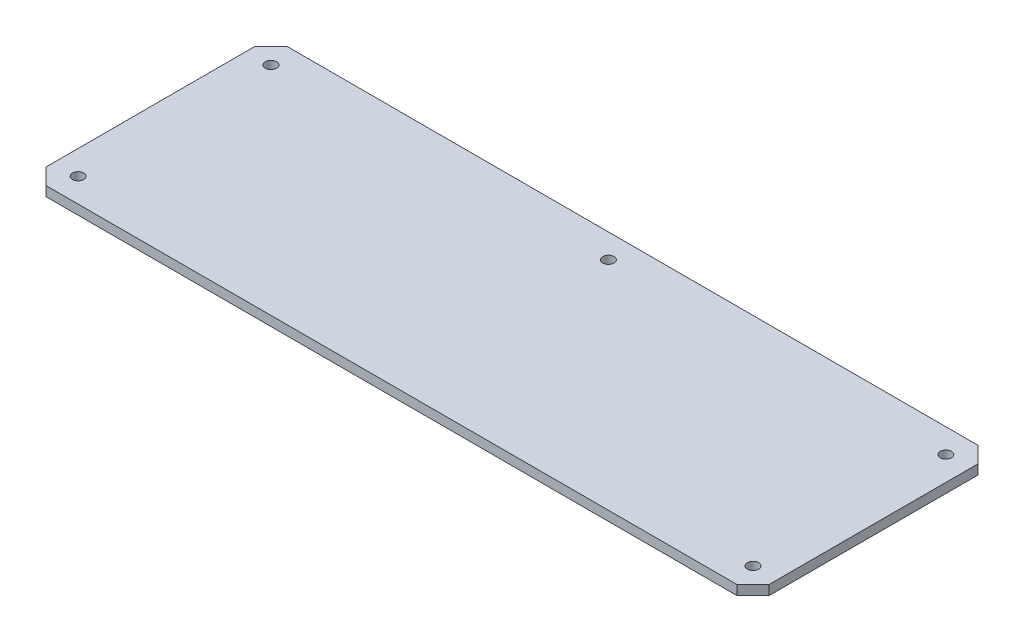
ISO-10303-21;
HEADER;
FILE_DESCRIPTION(('STEP AP214'),'2;1');
FILE_NAME('part.step','',(''),(''),'','','');
FILE_SCHEMA(('AUTOMOTIVE_DESIGN { 1 0 10303 214 1 1 1 1 }'));
ENDSEC;
DATA;
#1=APPLICATION_CONTEXT('core data for automotive mechanical design processes');
#2=APPLICATION_PROTOCOL_DEFINITION('international standard','automotive_design',2000,#1);
#3=PRODUCT_CONTEXT('',#1,'mechanical');
#4=PRODUCT('Part','Part','',(#3));
#5=PRODUCT_RELATED_PRODUCT_CATEGORY('part','',(#4));
#6=PRODUCT_DEFINITION_FORMATION('','',#4);
#7=PRODUCT_DEFINITION_CONTEXT('part definition',#1,'design');
#8=PRODUCT_DEFINITION('design','',#6,#7);
#9=PRODUCT_DEFINITION_SHAPE('','',#8);
#10=(LENGTH_UNIT() NAMED_UNIT(*) SI_UNIT(.MILLI.,.METRE.));
#11=(NAMED_UNIT(*) PLANE_ANGLE_UNIT() SI_UNIT($,.RADIAN.));
#12=(NAMED_UNIT(*) SI_UNIT($,.STERADIAN.) SOLID_ANGLE_UNIT());
#13=UNCERTAINTY_MEASURE_WITH_UNIT(LENGTH_MEASURE(1.E-05),#10,'distance_accuracy_value','');
#14=(GEOMETRIC_REPRESENTATION_CONTEXT(3) GLOBAL_UNCERTAINTY_ASSIGNED_CONTEXT((#13)) GLOBAL_UNIT_ASSIGNED_CONTEXT((#10,
#11,#12)) REPRESENTATION_CONTEXT('',''));
#15=CARTESIAN_POINT('',(0.,0.,0.));
#16=DIRECTION('',(0.,0.,1.));
#17=DIRECTION('',(1.,0.,0.));
#18=AXIS2_PLACEMENT_3D('',#15,#16,#17);
#19=CARTESIAN_POINT('',(225.,285.,-710.5));
#20=DIRECTION('',(1.,0.,0.));
#21=DIRECTION('',(0.,0.,-1.));
#22=AXIS2_PLACEMENT_3D('',#19,#20,#21);
#23=PLANE('',#22);
#24=DIRECTION('',(0.,0.,-1.));
#25=VECTOR('',#24,1.);
#26=CARTESIAN_POINT('',(225.,291.,-710.5));
#27=LINE('',#26,#25);
#28=CARTESIAN_POINT('',(225.,291.,-570.5));
#29=VERTEX_POINT('',#28);
#30=CARTESIAN_POINT('',(225.,291.,-700.5));
#31=VERTEX_POINT('',#30);
#32=EDGE_CURVE('E127',#29,#31,#27,.T.);
#33=ORIENTED_EDGE('',*,*,#32,.F.);
#34=DIRECTION('',(0.,-1.,0.));
#35=VECTOR('',#34,1.);
#36=CARTESIAN_POINT('',(225.,285.,-570.5));
#37=LINE('',#36,#35);
#38=CARTESIAN_POINT('',(225.,285.,-570.5));
#39=VERTEX_POINT('',#38);
#40=EDGE_CURVE('E75',#29,#39,#37,.T.);
#41=ORIENTED_EDGE('',*,*,#40,.T.);
#42=DIRECTION('',(0.,0.,-1.));
#43=VECTOR('',#42,1.);
#44=CARTESIAN_POINT('',(225.,285.,-710.5));
#45=LINE('',#44,#43);
#46=CARTESIAN_POINT('',(225.,285.,-700.5));
#47=VERTEX_POINT('',#46);
#48=EDGE_CURVE('E145',#39,#47,#45,.T.);
#49=ORIENTED_EDGE('',*,*,#48,.T.);
#50=DIRECTION('',(0.,1.,0.));
#51=VECTOR('',#50,1.);
#52=CARTESIAN_POINT('',(225.,285.,-700.5));
#53=LINE('',#52,#51);
#54=EDGE_CURVE('E142',#47,#31,#53,.T.);
#55=ORIENTED_EDGE('',*,*,#54,.T.);
#56=EDGE_LOOP('',(#33,#41,#49,#55));
#57=FACE_BOUND('',#56,.T.);
#58=ADVANCED_FACE('F67',(#57),#23,.T.);
#59=CARTESIAN_POINT('',(-225.,285.,-560.5));
#60=DIRECTION('',(0.,0.,1.));
#61=DIRECTION('',(1.,0.,0.));
#62=AXIS2_PLACEMENT_3D('',#59,#60,#61);
#63=PLANE('',#62);
#64=DIRECTION('',(1.,0.,0.));
#65=VECTOR('',#64,1.);
#66=CARTESIAN_POINT('',(-225.,285.,-560.5));
#67=LINE('',#66,#65);
#68=CARTESIAN_POINT('',(-215.,285.,-560.5));
#69=VERTEX_POINT('',#68);
#70=CARTESIAN_POINT('',(215.,285.,-560.5));
#71=VERTEX_POINT('',#70);
#72=EDGE_CURVE('E147',#69,#71,#67,.T.);
#73=ORIENTED_EDGE('',*,*,#72,.T.);
#74=DIRECTION('',(0.,1.,0.));
#75=VECTOR('',#74,1.);
#76=CARTESIAN_POINT('',(215.,285.,-560.5));
#77=LINE('',#76,#75);
#78=CARTESIAN_POINT('',(215.,291.,-560.5));
#79=VERTEX_POINT('',#78);
#80=EDGE_CURVE('E177',#71,#79,#77,.T.);
#81=ORIENTED_EDGE('',*,*,#80,.T.);
#82=DIRECTION('',(1.,0.,0.));
#83=VECTOR('',#82,1.);
#84=CARTESIAN_POINT('',(-225.,291.,-560.5));
#85=LINE('',#84,#83);
#86=CARTESIAN_POINT('',(-215.,291.,-560.5));
#87=VERTEX_POINT('',#86);
#88=EDGE_CURVE('E153',#87,#79,#85,.T.);
#89=ORIENTED_EDGE('',*,*,#88,.F.);
#90=DIRECTION('',(0.,-1.,0.));
#91=VECTOR('',#90,1.);
#92=CARTESIAN_POINT('',(-215.,285.,-560.5));
#93=LINE('',#92,#91);
#94=EDGE_CURVE('E173',#87,#69,#93,.T.);
#95=ORIENTED_EDGE('',*,*,#94,.T.);
#96=EDGE_LOOP('',(#73,#81,#89,#95));
#97=FACE_BOUND('',#96,.T.);
#98=ADVANCED_FACE('F183',(#97),#63,.T.);
#99=CARTESIAN_POINT('',(-225.,285.,-710.5));
#100=DIRECTION('',(-1.,0.,0.));
#101=DIRECTION('',(0.,0.,1.));
#102=AXIS2_PLACEMENT_3D('',#99,#100,#101);
#103=PLANE('',#102);
#104=DIRECTION('',(0.,0.,1.));
#105=VECTOR('',#104,1.);
#106=CARTESIAN_POINT('',(-225.,285.,-710.5));
#107=LINE('',#106,#105);
#108=CARTESIAN_POINT('',(-225.,285.,-700.5));
#109=VERTEX_POINT('',#108);
#110=CARTESIAN_POINT('',(-225.,285.,-570.5));
#111=VERTEX_POINT('',#110);
#112=EDGE_CURVE('E150',#109,#111,#107,.T.);
#113=ORIENTED_EDGE('',*,*,#112,.T.);
#114=DIRECTION('',(0.,1.,0.));
#115=VECTOR('',#114,1.);
#116=CARTESIAN_POINT('',(-225.,285.,-570.5));
#117=LINE('',#116,#115);
#118=CARTESIAN_POINT('',(-225.,291.,-570.5));
#119=VERTEX_POINT('',#118);
#120=EDGE_CURVE('E168',#111,#119,#117,.T.);
#121=ORIENTED_EDGE('',*,*,#120,.T.);
#122=DIRECTION('',(0.,0.,1.));
#123=VECTOR('',#122,1.);
#124=CARTESIAN_POINT('',(-225.,291.,-710.5));
#125=LINE('',#124,#123);
#126=CARTESIAN_POINT('',(-225.,291.,-700.5));
#127=VERTEX_POINT('',#126);
#128=EDGE_CURVE('E189',#127,#119,#125,.T.);
#129=ORIENTED_EDGE('',*,*,#128,.F.);
#130=DIRECTION('',(0.,-1.,0.));
#131=VECTOR('',#130,1.);
#132=CARTESIAN_POINT('',(-225.,285.,-700.5));
#133=LINE('',#132,#131);
#134=EDGE_CURVE('E164',#127,#109,#133,.T.);
#135=ORIENTED_EDGE('',*,*,#134,.T.);
#136=EDGE_LOOP('',(#113,#121,#129,#135));
#137=FACE_BOUND('',#136,.T.);
#138=ADVANCED_FACE('F258',(#137),#103,.T.);
#139=CARTESIAN_POINT('',(-225.,285.,-710.5));
#140=DIRECTION('',(0.,0.,-1.));
#141=DIRECTION('',(-1.,0.,0.));
#142=AXIS2_PLACEMENT_3D('',#139,#140,#141);
#143=PLANE('',#142);
#144=DIRECTION('',(-1.,0.,0.));
#145=VECTOR('',#144,1.);
#146=CARTESIAN_POINT('',(-225.,285.,-710.5));
#147=LINE('',#146,#145);
#148=CARTESIAN_POINT('',(215.,285.,-710.5));
#149=VERTEX_POINT('',#148);
#150=CARTESIAN_POINT('',(-215.,285.,-710.5));
#151=VERTEX_POINT('',#150);
#152=EDGE_CURVE('E190',#149,#151,#147,.T.);
#153=ORIENTED_EDGE('',*,*,#152,.T.);
#154=DIRECTION('',(0.,1.,0.));
#155=VECTOR('',#154,1.);
#156=CARTESIAN_POINT('',(-215.,285.,-710.5));
#157=LINE('',#156,#155);
#158=CARTESIAN_POINT('',(-215.,291.,-710.5));
#159=VERTEX_POINT('',#158);
#160=EDGE_CURVE('E159',#151,#159,#157,.T.);
#161=ORIENTED_EDGE('',*,*,#160,.T.);
#162=DIRECTION('',(-1.,0.,0.));
#163=VECTOR('',#162,1.);
#164=CARTESIAN_POINT('',(-225.,291.,-710.5));
#165=LINE('',#164,#163);
#166=CARTESIAN_POINT('',(215.,291.,-710.5));
#167=VERTEX_POINT('',#166);
#168=EDGE_CURVE('E134',#167,#159,#165,.T.);
#169=ORIENTED_EDGE('',*,*,#168,.F.);
#170=DIRECTION('',(0.,-1.,0.));
#171=VECTOR('',#170,1.);
#172=CARTESIAN_POINT('',(215.,285.,-710.5));
#173=LINE('',#172,#171);
#174=EDGE_CURVE('E143',#167,#149,#173,.T.);
#175=ORIENTED_EDGE('',*,*,#174,.T.);
#176=EDGE_LOOP('',(#153,#161,#169,#175));
#177=FACE_BOUND('',#176,.T.);
#178=ADVANCED_FACE('F235',(#177),#143,.T.);
#179=CARTESIAN_POINT('',(0.,285.,0.));
#180=DIRECTION('',(0.,1.,0.));
#181=DIRECTION('',(0.,0.,1.));
#182=AXIS2_PLACEMENT_3D('',#179,#180,#181);
#183=PLANE('',#182);
#184=CARTESIAN_POINT('',(-210.,285.,-575.5));
#185=DIRECTION('',(0.,-1.,0.));
#186=DIRECTION('',(0.,0.,-1.));
#187=AXIS2_PLACEMENT_3D('',#184,#185,#186);
#188=CIRCLE('',#187,3.5);
#189=CARTESIAN_POINT('',(-210.,285.,-579.));
#190=VERTEX_POINT('',#189);
#191=EDGE_CURVE('E225',#190,#190,#188,.T.);
#192=ORIENTED_EDGE('',*,*,#191,.F.);
#193=EDGE_LOOP('',(#192));
#194=FACE_BOUND('',#193,.T.);
#195=CARTESIAN_POINT('',(-210.,285.,-695.5));
#196=DIRECTION('',(0.,-1.,0.));
#197=DIRECTION('',(0.,0.,-1.));
#198=AXIS2_PLACEMENT_3D('',#195,#196,#197);
#199=CIRCLE('',#198,3.5);
#200=CARTESIAN_POINT('',(-210.,285.,-699.));
#201=VERTEX_POINT('',#200);
#202=EDGE_CURVE('E219',#201,#201,#199,.T.);
#203=ORIENTED_EDGE('',*,*,#202,.F.);
#204=EDGE_LOOP('',(#203));
#205=FACE_BOUND('',#204,.T.);
#206=CARTESIAN_POINT('',(210.,285.,-695.5));
#207=DIRECTION('',(0.,-1.,0.));
#208=DIRECTION('',(0.,0.,-1.));
#209=AXIS2_PLACEMENT_3D('',#206,#207,#208);
#210=CIRCLE('',#209,3.5);
#211=CARTESIAN_POINT('',(210.,285.,-699.));
#212=VERTEX_POINT('',#211);
#213=EDGE_CURVE('E213',#212,#212,#210,.T.);
#214=ORIENTED_EDGE('',*,*,#213,.F.);
#215=EDGE_LOOP('',(#214));
#216=FACE_BOUND('',#215,.T.);
#217=CARTESIAN_POINT('',(210.,285.,-575.5));
#218=DIRECTION('',(0.,-1.,0.));
#219=DIRECTION('',(0.,0.,-1.));
#220=AXIS2_PLACEMENT_3D('',#217,#218,#219);
#221=CIRCLE('',#220,3.5);
#222=CARTESIAN_POINT('',(210.,285.,-579.));
#223=VERTEX_POINT('',#222);
#224=EDGE_CURVE('E207',#223,#223,#221,.T.);
#225=ORIENTED_EDGE('',*,*,#224,.F.);
#226=EDGE_LOOP('',(#225));
#227=FACE_BOUND('',#226,.T.);
#228=CARTESIAN_POINT('',(1.11022302462516E-13,285.,-695.5));
#229=DIRECTION('',(0.,-1.,0.));
#230=DIRECTION('',(0.,0.,-1.));
#231=AXIS2_PLACEMENT_3D('',#228,#229,#230);
#232=CIRCLE('',#231,3.5);
#233=CARTESIAN_POINT('',(1.11022302462516E-13,285.,-699.));
#234=VERTEX_POINT('',#233);
#235=EDGE_CURVE('E201',#234,#234,#232,.T.);
#236=ORIENTED_EDGE('',*,*,#235,.F.);
#237=EDGE_LOOP('',(#236));
#238=FACE_BOUND('',#237,.T.);
#239=ORIENTED_EDGE('',*,*,#48,.F.);
#240=DIRECTION('',(0.707106781186548,0.,-0.707106781186548));
#241=VECTOR('',#240,1.);
#242=CARTESIAN_POINT('',(215.,285.,-560.5));
#243=LINE('',#242,#241);
#244=EDGE_CURVE('E13',#39,#71,#243,.F.);
#245=ORIENTED_EDGE('',*,*,#244,.T.);
#246=ORIENTED_EDGE('',*,*,#72,.F.);
#247=DIRECTION('',(0.707106781186548,0.,0.707106781186548));
#248=VECTOR('',#247,1.);
#249=CARTESIAN_POINT('',(-225.,285.,-570.5));
#250=LINE('',#249,#248);
#251=EDGE_CURVE('E175',#69,#111,#250,.F.);
#252=ORIENTED_EDGE('',*,*,#251,.T.);
#253=ORIENTED_EDGE('',*,*,#112,.F.);
#254=DIRECTION('',(-0.707106781186548,0.,0.707106781186548));
#255=VECTOR('',#254,1.);
#256=CARTESIAN_POINT('',(-215.,285.,-710.5));
#257=LINE('',#256,#255);
#258=EDGE_CURVE('E166',#109,#151,#257,.F.);
#259=ORIENTED_EDGE('',*,*,#258,.T.);
#260=ORIENTED_EDGE('',*,*,#152,.F.);
#261=DIRECTION('',(-0.707106781186548,0.,-0.707106781186548));
#262=VECTOR('',#261,1.);
#263=CARTESIAN_POINT('',(225.,285.,-700.5));
#264=LINE('',#263,#262);
#265=EDGE_CURVE('E157',#149,#47,#264,.F.);
#266=ORIENTED_EDGE('',*,*,#265,.T.);
#267=EDGE_LOOP('',(#239,#245,#246,#252,#253,#259,#260,#266));
#268=FACE_BOUND('',#267,.T.);
#269=ADVANCED_FACE('F232',(#194,#205,#216,#227,#238,#268),#183,.F.);
#270=CARTESIAN_POINT('',(0.,291.,0.));
#271=DIRECTION('',(0.,1.,0.));
#272=DIRECTION('',(0.,0.,1.));
#273=AXIS2_PLACEMENT_3D('',#270,#271,#272);
#274=PLANE('',#273);
#275=CARTESIAN_POINT('',(-210.,291.,-575.5));
#276=DIRECTION('',(0.,1.,0.));
#277=DIRECTION('',(0.,0.,1.));
#278=AXIS2_PLACEMENT_3D('',#275,#276,#277);
#279=CIRCLE('',#278,3.5);
#280=CARTESIAN_POINT('',(-210.,291.,-572.));
#281=VERTEX_POINT('',#280);
#282=EDGE_CURVE('E222',#281,#281,#279,.T.);
#283=ORIENTED_EDGE('',*,*,#282,.F.);
#284=EDGE_LOOP('',(#283));
#285=FACE_BOUND('',#284,.T.);
#286=CARTESIAN_POINT('',(-210.,291.,-695.5));
#287=DIRECTION('',(0.,1.,0.));
#288=DIRECTION('',(0.,0.,1.));
#289=AXIS2_PLACEMENT_3D('',#286,#287,#288);
#290=CIRCLE('',#289,3.5);
#291=CARTESIAN_POINT('',(-210.,291.,-692.));
#292=VERTEX_POINT('',#291);
#293=EDGE_CURVE('E216',#292,#292,#290,.T.);
#294=ORIENTED_EDGE('',*,*,#293,.F.);
#295=EDGE_LOOP('',(#294));
#296=FACE_BOUND('',#295,.T.);
#297=CARTESIAN_POINT('',(210.,291.,-695.5));
#298=DIRECTION('',(0.,1.,0.));
#299=DIRECTION('',(0.,0.,1.));
#300=AXIS2_PLACEMENT_3D('',#297,#298,#299);
#301=CIRCLE('',#300,3.5);
#302=CARTESIAN_POINT('',(210.,291.,-692.));
#303=VERTEX_POINT('',#302);
#304=EDGE_CURVE('E210',#303,#303,#301,.T.);
#305=ORIENTED_EDGE('',*,*,#304,.F.);
#306=EDGE_LOOP('',(#305));
#307=FACE_BOUND('',#306,.T.);
#308=CARTESIAN_POINT('',(210.,291.,-575.5));
#309=DIRECTION('',(0.,1.,0.));
#310=DIRECTION('',(0.,0.,1.));
#311=AXIS2_PLACEMENT_3D('',#308,#309,#310);
#312=CIRCLE('',#311,3.5);
#313=CARTESIAN_POINT('',(210.,291.,-572.));
#314=VERTEX_POINT('',#313);
#315=EDGE_CURVE('E204',#314,#314,#312,.T.);
#316=ORIENTED_EDGE('',*,*,#315,.F.);
#317=EDGE_LOOP('',(#316));
#318=FACE_BOUND('',#317,.T.);
#319=CARTESIAN_POINT('',(1.11022302462516E-13,291.,-695.5));
#320=DIRECTION('',(0.,1.,0.));
#321=DIRECTION('',(0.,0.,1.));
#322=AXIS2_PLACEMENT_3D('',#319,#320,#321);
#323=CIRCLE('',#322,3.5);
#324=CARTESIAN_POINT('',(1.11022302462516E-13,291.,-692.));
#325=VERTEX_POINT('',#324);
#326=EDGE_CURVE('E135',#325,#325,#323,.T.);
#327=ORIENTED_EDGE('',*,*,#326,.F.);
#328=EDGE_LOOP('',(#327));
#329=FACE_BOUND('',#328,.T.);
#330=ORIENTED_EDGE('',*,*,#88,.T.);
#331=DIRECTION('',(-0.707106781186548,0.,0.707106781186548));
#332=VECTOR('',#331,1.);
#333=CARTESIAN_POINT('',(-172.75,291.,-172.75));
#334=LINE('',#333,#332);
#335=EDGE_CURVE('E89',#79,#29,#334,.F.);
#336=ORIENTED_EDGE('',*,*,#335,.T.);
#337=ORIENTED_EDGE('',*,*,#32,.T.);
#338=DIRECTION('',(0.707106781186548,0.,0.707106781186548));
#339=VECTOR('',#338,1.);
#340=CARTESIAN_POINT('',(462.75,291.,-462.75));
#341=LINE('',#340,#339);
#342=EDGE_CURVE('E131',#31,#167,#341,.F.);
#343=ORIENTED_EDGE('',*,*,#342,.T.);
#344=ORIENTED_EDGE('',*,*,#168,.T.);
#345=DIRECTION('',(0.707106781186548,0.,-0.707106781186548));
#346=VECTOR('',#345,1.);
#347=CARTESIAN_POINT('',(-462.75,291.,-462.75));
#348=LINE('',#347,#346);
#349=EDGE_CURVE('E162',#159,#127,#348,.F.);
#350=ORIENTED_EDGE('',*,*,#349,.T.);
#351=ORIENTED_EDGE('',*,*,#128,.T.);
#352=DIRECTION('',(-0.707106781186548,0.,-0.707106781186548));
#353=VECTOR('',#352,1.);
#354=CARTESIAN_POINT('',(172.75,291.,-172.75));
#355=LINE('',#354,#353);
#356=EDGE_CURVE('E171',#119,#87,#355,.F.);
#357=ORIENTED_EDGE('',*,*,#356,.T.);
#358=EDGE_LOOP('',(#330,#336,#337,#343,#344,#350,#351,#357));
#359=FACE_BOUND('',#358,.T.);
#360=ADVANCED_FACE('F129',(#285,#296,#307,#318,#329,#359),#274,.T.);
#361=CARTESIAN_POINT('',(1.11022302462516E-13,285.,-695.5));
#362=DIRECTION('',(0.,-1.,0.));
#363=DIRECTION('',(0.,0.,-1.));
#364=AXIS2_PLACEMENT_3D('',#361,#362,#363);
#365=CYLINDRICAL_SURFACE('',#364,3.5);
#366=ORIENTED_EDGE('',*,*,#235,.T.);
#367=EDGE_LOOP('',(#366));
#368=FACE_BOUND('',#367,.T.);
#369=ORIENTED_EDGE('',*,*,#326,.T.);
#370=EDGE_LOOP('',(#369));
#371=FACE_BOUND('',#370,.T.);
#372=ADVANCED_FACE('F283',(#368,#371),#365,.F.);
#373=CARTESIAN_POINT('',(210.,285.,-575.5));
#374=DIRECTION('',(0.,-1.,0.));
#375=DIRECTION('',(0.,0.,-1.));
#376=AXIS2_PLACEMENT_3D('',#373,#374,#375);
#377=CYLINDRICAL_SURFACE('',#376,3.5);
#378=ORIENTED_EDGE('',*,*,#224,.T.);
#379=EDGE_LOOP('',(#378));
#380=FACE_BOUND('',#379,.T.);
#381=ORIENTED_EDGE('',*,*,#315,.T.);
#382=EDGE_LOOP('',(#381));
#383=FACE_BOUND('',#382,.T.);
#384=ADVANCED_FACE('F288',(#380,#383),#377,.F.);
#385=CARTESIAN_POINT('',(210.,285.,-695.5));
#386=DIRECTION('',(0.,-1.,0.));
#387=DIRECTION('',(0.,0.,-1.));
#388=AXIS2_PLACEMENT_3D('',#385,#386,#387);
#389=CYLINDRICAL_SURFACE('',#388,3.5);
#390=ORIENTED_EDGE('',*,*,#213,.T.);
#391=EDGE_LOOP('',(#390));
#392=FACE_BOUND('',#391,.T.);
#393=ORIENTED_EDGE('',*,*,#304,.T.);
#394=EDGE_LOOP('',(#393));
#395=FACE_BOUND('',#394,.T.);
#396=ADVANCED_FACE('F292',(#392,#395),#389,.F.);
#397=CARTESIAN_POINT('',(-210.,285.,-695.5));
#398=DIRECTION('',(0.,-1.,0.));
#399=DIRECTION('',(0.,0.,-1.));
#400=AXIS2_PLACEMENT_3D('',#397,#398,#399);
#401=CYLINDRICAL_SURFACE('',#400,3.5);
#402=ORIENTED_EDGE('',*,*,#202,.T.);
#403=EDGE_LOOP('',(#402));
#404=FACE_BOUND('',#403,.T.);
#405=ORIENTED_EDGE('',*,*,#293,.T.);
#406=EDGE_LOOP('',(#405));
#407=FACE_BOUND('',#406,.T.);
#408=ADVANCED_FACE('F296',(#404,#407),#401,.F.);
#409=CARTESIAN_POINT('',(-210.,285.,-575.5));
#410=DIRECTION('',(0.,-1.,0.));
#411=DIRECTION('',(0.,0.,-1.));
#412=AXIS2_PLACEMENT_3D('',#409,#410,#411);
#413=CYLINDRICAL_SURFACE('',#412,3.5);
#414=ORIENTED_EDGE('',*,*,#191,.T.);
#415=EDGE_LOOP('',(#414));
#416=FACE_BOUND('',#415,.T.);
#417=ORIENTED_EDGE('',*,*,#282,.T.);
#418=EDGE_LOOP('',(#417));
#419=FACE_BOUND('',#418,.T.);
#420=ADVANCED_FACE('F229',(#416,#419),#413,.F.);
#421=CARTESIAN_POINT('',(225.,285.,-700.5));
#422=DIRECTION('',(-0.707106781186547,0.,0.707106781186547));
#423=DIRECTION('',(0.,1.,0.));
#424=AXIS2_PLACEMENT_3D('',#421,#422,#423);
#425=PLANE('',#424);
#426=ORIENTED_EDGE('',*,*,#265,.F.);
#427=ORIENTED_EDGE('',*,*,#174,.F.);
#428=ORIENTED_EDGE('',*,*,#342,.F.);
#429=ORIENTED_EDGE('',*,*,#54,.F.);
#430=EDGE_LOOP('',(#426,#427,#428,#429));
#431=FACE_BOUND('',#430,.T.);
#432=ADVANCED_FACE('F141',(#431),#425,.F.);
#433=CARTESIAN_POINT('',(-215.,285.,-710.5));
#434=DIRECTION('',(0.707106781186547,0.,0.707106781186547));
#435=DIRECTION('',(0.,1.,0.));
#436=AXIS2_PLACEMENT_3D('',#433,#434,#435);
#437=PLANE('',#436);
#438=ORIENTED_EDGE('',*,*,#258,.F.);
#439=ORIENTED_EDGE('',*,*,#134,.F.);
#440=ORIENTED_EDGE('',*,*,#349,.F.);
#441=ORIENTED_EDGE('',*,*,#160,.F.);
#442=EDGE_LOOP('',(#438,#439,#440,#441));
#443=FACE_BOUND('',#442,.T.);
#444=ADVANCED_FACE('F251',(#443),#437,.F.);
#445=CARTESIAN_POINT('',(-225.,285.,-570.5));
#446=DIRECTION('',(0.707106781186547,0.,-0.707106781186547));
#447=DIRECTION('',(0.,1.,0.));
#448=AXIS2_PLACEMENT_3D('',#445,#446,#447);
#449=PLANE('',#448);
#450=ORIENTED_EDGE('',*,*,#251,.F.);
#451=ORIENTED_EDGE('',*,*,#94,.F.);
#452=ORIENTED_EDGE('',*,*,#356,.F.);
#453=ORIENTED_EDGE('',*,*,#120,.F.);
#454=EDGE_LOOP('',(#450,#451,#452,#453));
#455=FACE_BOUND('',#454,.T.);
#456=ADVANCED_FACE('F247',(#455),#449,.F.);
#457=CARTESIAN_POINT('',(215.,285.,-560.5));
#458=DIRECTION('',(-0.707106781186547,0.,-0.707106781186547));
#459=DIRECTION('',(0.,1.,0.));
#460=AXIS2_PLACEMENT_3D('',#457,#458,#459);
#461=PLANE('',#460);
#462=ORIENTED_EDGE('',*,*,#244,.F.);
#463=ORIENTED_EDGE('',*,*,#40,.F.);
#464=ORIENTED_EDGE('',*,*,#335,.F.);
#465=ORIENTED_EDGE('',*,*,#80,.F.);
#466=EDGE_LOOP('',(#462,#463,#464,#465));
#467=FACE_BOUND('',#466,.T.);
#468=ADVANCED_FACE('F69',(#467),#461,.F.);
#469=CLOSED_SHELL('',(#58,#98,#138,#178,#269,#360,#372,#384,#396,#408,#420,#432,#444,#456,#468));
#470=MANIFOLD_SOLID_BREP('B2',#469);
#471=ADVANCED_BREP_SHAPE_REPRESENTATION('',(#18,#470),#14);
#472=SHAPE_DEFINITION_REPRESENTATION(#9,#471);
ENDSEC;
END-ISO-10303-21;
